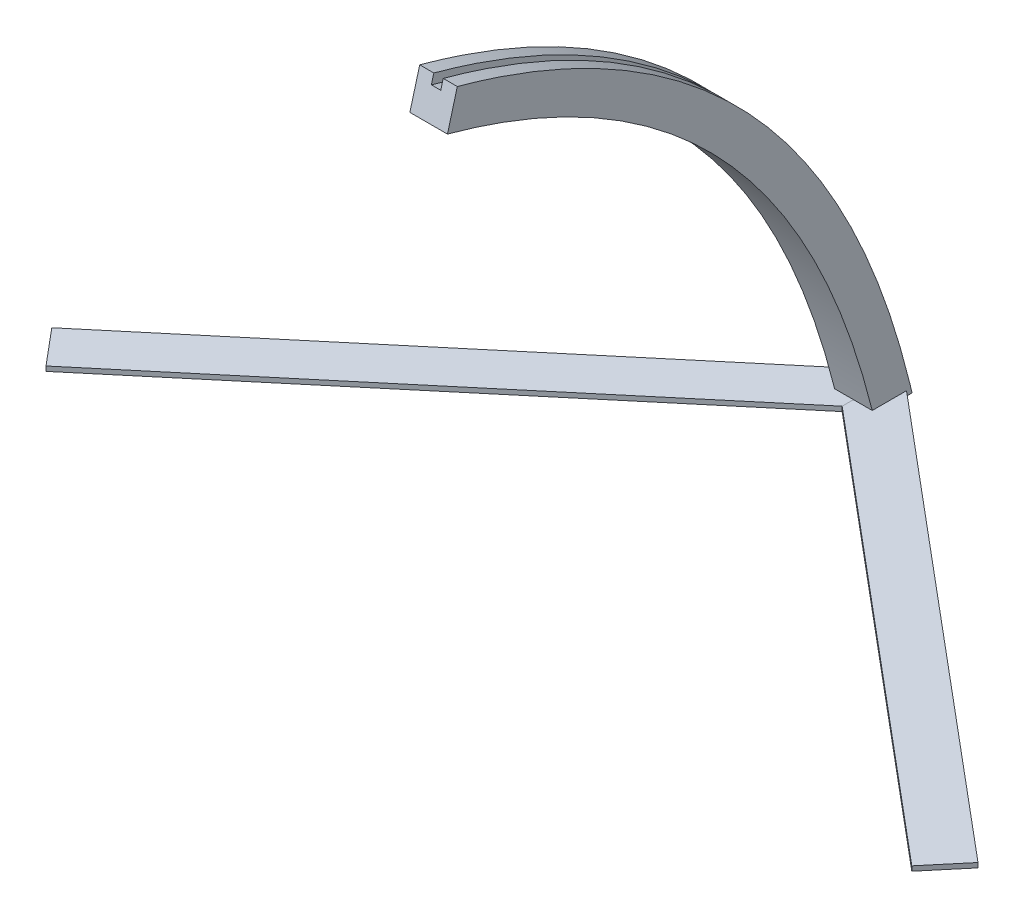
ISO-10303-21;
HEADER;
FILE_DESCRIPTION(('STEP AP214'),'2;1');
FILE_NAME('part.step','',(''),(''),'','','');
FILE_SCHEMA(('AUTOMOTIVE_DESIGN { 1 0 10303 214 1 1 1 1 }'));
ENDSEC;
DATA;
#1=APPLICATION_CONTEXT('core data for automotive mechanical design processes');
#2=APPLICATION_PROTOCOL_DEFINITION('international standard','automotive_design',2000,#1);
#3=PRODUCT_CONTEXT('',#1,'mechanical');
#4=PRODUCT('Part','Part','',(#3));
#5=PRODUCT_RELATED_PRODUCT_CATEGORY('part','',(#4));
#6=PRODUCT_DEFINITION_FORMATION('','',#4);
#7=PRODUCT_DEFINITION_CONTEXT('part definition',#1,'design');
#8=PRODUCT_DEFINITION('design','',#6,#7);
#9=PRODUCT_DEFINITION_SHAPE('','',#8);
#10=(LENGTH_UNIT() NAMED_UNIT(*) SI_UNIT(.MILLI.,.METRE.));
#11=(NAMED_UNIT(*) PLANE_ANGLE_UNIT() SI_UNIT($,.RADIAN.));
#12=(NAMED_UNIT(*) SI_UNIT($,.STERADIAN.) SOLID_ANGLE_UNIT());
#13=UNCERTAINTY_MEASURE_WITH_UNIT(LENGTH_MEASURE(1.E-05),#10,'distance_accuracy_value','');
#14=(GEOMETRIC_REPRESENTATION_CONTEXT(3) GLOBAL_UNCERTAINTY_ASSIGNED_CONTEXT((#13)) GLOBAL_UNIT_ASSIGNED_CONTEXT((#10,
#11,#12)) REPRESENTATION_CONTEXT('',''));
#15=CARTESIAN_POINT('',(0.,0.,0.));
#16=DIRECTION('',(0.,0.,1.));
#17=DIRECTION('',(1.,0.,0.));
#18=AXIS2_PLACEMENT_3D('',#15,#16,#17);
#19=CARTESIAN_POINT('',(-5.08,2.48064780974044,-4.93363272657894));
#20=DIRECTION('',(-1.,0.,0.));
#21=DIRECTION('',(0.,0.,1.));
#22=AXIS2_PLACEMENT_3D('',#19,#20,#21);
#23=PLANE('',#22);
#24=DIRECTION('',(0.,0.97118754460215,0.238316497980409));
#25=VECTOR('',#24,1.);
#26=CARTESIAN_POINT('',(-5.08,-2.69966655316738,-6.20481292680644));
#27=LINE('',#26,#25);
#28=CARTESIAN_POINT('',(-5.08,0.,-5.54235068432653));
#29=VERTEX_POINT('',#28);
#30=CARTESIAN_POINT('',(-5.08,2.48064780974044,-4.93363272657894));
#31=VERTEX_POINT('',#30);
#32=EDGE_CURVE('E43',#29,#31,#27,.T.);
#33=ORIENTED_EDGE('',*,*,#32,.F.);
#34=DIRECTION('',(0.,0.,1.));
#35=VECTOR('',#34,1.);
#36=CARTESIAN_POINT('',(-5.08,0.,-4.93363272657894));
#37=LINE('',#36,#35);
#38=CARTESIAN_POINT('',(-5.08,0.,-4.02671016087938));
#39=VERTEX_POINT('',#38);
#40=EDGE_CURVE('E367',#29,#39,#37,.T.);
#41=ORIENTED_EDGE('',*,*,#40,.T.);
#42=DIRECTION('',(0.,-1.,0.));
#43=VECTOR('',#42,1.);
#44=CARTESIAN_POINT('',(-5.08,1.26999999999999,-4.02671016087938));
#45=LINE('',#44,#43);
#46=CARTESIAN_POINT('',(-5.08,1.27,-4.02671016087938));
#47=VERTEX_POINT('',#46);
#48=EDGE_CURVE('E267',#47,#39,#45,.T.);
#49=ORIENTED_EDGE('',*,*,#48,.F.);
#50=DIRECTION('',(0.,0.,1.));
#51=VECTOR('',#50,1.);
#52=CARTESIAN_POINT('',(-5.08,1.26999999999999,106.464382213805));
#53=LINE('',#52,#51);
#54=CARTESIAN_POINT('',(-5.08,1.27,5.2338859838432));
#55=VERTEX_POINT('',#54);
#56=EDGE_CURVE('E50',#47,#55,#53,.T.);
#57=ORIENTED_EDGE('',*,*,#56,.T.);
#58=CARTESIAN_POINT('',(-5.08,0.0593521902594873,4.9336327265789));
#59=CARTESIAN_POINT('',(-5.08,33.2508610878055,13.0783872666519));
#60=CARTESIAN_POINT('',(-5.08,59.8755567879164,26.7405853876721));
#61=CARTESIAN_POINT('',(-5.08,90.5340659689814,55.3980025006643));
#62=CARTESIAN_POINT('',(-5.08,99.2141525950362,66.3212104822444));
#63=CARTESIAN_POINT('',(-5.08,113.560991349138,91.0169754989488));
#64=CARTESIAN_POINT('',(-5.08,119.2261047089,104.792235016412));
#65=CARTESIAN_POINT('',(-5.08,123.367568463531,120.042040830703));
#66=B_SPLINE_CURVE_WITH_KNOTS('',3,(#58,#59,#60,#61,#62,#63,#64,#65),.UNSPECIFIED.,.F.,.F.,(4,2,
2,4),(0.,0.5,0.75,1.),.UNSPECIFIED.);
#67=CARTESIAN_POINT('',(-5.08,123.367568463531,120.042040830703));
#68=VERTEX_POINT('',#67);
#69=EDGE_CURVE('E402',#55,#68,#66,.T.);
#70=ORIENTED_EDGE('',*,*,#69,.T.);
#71=DIRECTION('',(0.,-0.965045578045034,0.262082109835309));
#72=VECTOR('',#71,1.);
#73=CARTESIAN_POINT('',(-5.08,133.172431536469,117.379286594777));
#74=LINE('',#73,#72);
#75=CARTESIAN_POINT('',(-5.08,133.172431536469,117.379286594777));
#76=VERTEX_POINT('',#75);
#77=EDGE_CURVE('E420',#76,#68,#74,.T.);
#78=ORIENTED_EDGE('',*,*,#77,.F.);
#79=CARTESIAN_POINT('',(-5.08,2.48064780974044,-4.93363272657894));
#80=CARTESIAN_POINT('',(-5.08,36.9738163687706,3.53053177074244));
#81=CARTESIAN_POINT('',(-5.08,65.3581260630799,17.9579037867018));
#82=CARTESIAN_POINT('',(-5.08,98.199616882343,48.6558185306366));
#83=CARTESIAN_POINT('',(-5.08,107.517278907934,60.3878839424756));
#84=CARTESIAN_POINT('',(-5.08,122.828101424715,86.742991263929));
#85=CARTESIAN_POINT('',(-5.08,128.82290068473,101.363330690402));
#86=CARTESIAN_POINT('',(-5.08,133.172431536469,117.379286594777));
#87=B_SPLINE_CURVE_WITH_KNOTS('',3,(#79,#80,#81,#82,#83,#84,#85,#86),.UNSPECIFIED.,.F.,.F.,(4,2,
2,4),(0.,0.5,0.75,1.),.UNSPECIFIED.);
#88=EDGE_CURVE('E437',#31,#76,#87,.T.);
#89=ORIENTED_EDGE('',*,*,#88,.F.);
#90=EDGE_LOOP('',(#33,#41,#49,#57,#70,#78,#89));
#91=FACE_BOUND('',#90,.T.);
#92=ADVANCED_FACE('F39',(#91),#23,.T.);
#93=CARTESIAN_POINT('',(5.08,2.48064780974044,-4.93363272657894));
#94=DIRECTION('',(-1.,0.,0.));
#95=DIRECTION('',(0.,0.,1.));
#96=AXIS2_PLACEMENT_3D('',#93,#94,#95);
#97=PLANE('',#96);
#98=DIRECTION('',(0.,1.,0.));
#99=VECTOR('',#98,1.);
#100=CARTESIAN_POINT('',(5.08,1.27,-4.0267101608794));
#101=LINE('',#100,#99);
#102=CARTESIAN_POINT('',(5.08,0.,-4.0267101608794));
#103=VERTEX_POINT('',#102);
#104=CARTESIAN_POINT('',(5.08,1.27,-4.0267101608794));
#105=VERTEX_POINT('',#104);
#106=EDGE_CURVE('E284',#103,#105,#101,.T.);
#107=ORIENTED_EDGE('',*,*,#106,.F.);
#108=DIRECTION('',(0.,0.,1.));
#109=VECTOR('',#108,1.);
#110=CARTESIAN_POINT('',(5.08,0.,-4.93363272657894));
#111=LINE('',#110,#109);
#112=CARTESIAN_POINT('',(5.08,0.,-5.54235068432653));
#113=VERTEX_POINT('',#112);
#114=EDGE_CURVE('E204',#103,#113,#111,.F.);
#115=ORIENTED_EDGE('',*,*,#114,.T.);
#116=DIRECTION('',(0.,0.97118754460215,0.238316497980409));
#117=VECTOR('',#116,1.);
#118=CARTESIAN_POINT('',(5.08,-2.69966655316738,-6.20481292680644));
#119=LINE('',#118,#117);
#120=CARTESIAN_POINT('',(5.08,2.48064780974048,-4.93363272657893));
#121=VERTEX_POINT('',#120);
#122=EDGE_CURVE('E199',#113,#121,#119,.T.);
#123=ORIENTED_EDGE('',*,*,#122,.T.);
#124=CARTESIAN_POINT('',(5.08,2.48064780974044,-4.93363272657894));
#125=CARTESIAN_POINT('',(5.08,36.9738163687706,3.53053177074244));
#126=CARTESIAN_POINT('',(5.08,65.3581260630799,17.9579037867018));
#127=CARTESIAN_POINT('',(5.08,98.199616882343,48.6558185306366));
#128=CARTESIAN_POINT('',(5.08,107.517278907934,60.3878839424756));
#129=CARTESIAN_POINT('',(5.08,122.828101424715,86.742991263929));
#130=CARTESIAN_POINT('',(5.08,128.82290068473,101.363330690402));
#131=CARTESIAN_POINT('',(5.08,133.172431536469,117.379286594777));
#132=B_SPLINE_CURVE_WITH_KNOTS('',3,(#124,#125,#126,#127,#128,#129,#130,#131),.UNSPECIFIED.,.F.,
.F.,(4,2,2,4),(0.,0.5,0.75,1.),.UNSPECIFIED.);
#133=CARTESIAN_POINT('',(5.08,133.172431536469,117.379286594777));
#134=VERTEX_POINT('',#133);
#135=EDGE_CURVE('E384',#121,#134,#132,.T.);
#136=ORIENTED_EDGE('',*,*,#135,.T.);
#137=DIRECTION('',(0.,0.965045578045034,-0.262082109835309));
#138=VECTOR('',#137,1.);
#139=CARTESIAN_POINT('',(5.08,133.172431536469,117.379286594777));
#140=LINE('',#139,#138);
#141=CARTESIAN_POINT('',(5.08,123.367568463531,120.042040830703));
#142=VERTEX_POINT('',#141);
#143=EDGE_CURVE('E419',#142,#134,#140,.T.);
#144=ORIENTED_EDGE('',*,*,#143,.F.);
#145=CARTESIAN_POINT('',(5.08,0.0593521902594873,4.9336327265789));
#146=CARTESIAN_POINT('',(5.08,33.2508610878055,13.0783872666519));
#147=CARTESIAN_POINT('',(5.08,59.8755567879164,26.7405853876721));
#148=CARTESIAN_POINT('',(5.08,90.5340659689814,55.3980025006643));
#149=CARTESIAN_POINT('',(5.08,99.2141525950362,66.3212104822444));
#150=CARTESIAN_POINT('',(5.08,113.560991349138,91.0169754989488));
#151=CARTESIAN_POINT('',(5.08,119.2261047089,104.792235016412));
#152=CARTESIAN_POINT('',(5.08,123.367568463531,120.042040830703));
#153=B_SPLINE_CURVE_WITH_KNOTS('',3,(#145,#146,#147,#148,#149,#150,#151,#152),.UNSPECIFIED.,.F.,
.F.,(4,2,2,4),(0.,0.5,0.75,1.),.UNSPECIFIED.);
#154=CARTESIAN_POINT('',(5.08,1.27,5.23388598388158));
#155=VERTEX_POINT('',#154);
#156=EDGE_CURVE('E397',#155,#142,#153,.T.);
#157=ORIENTED_EDGE('',*,*,#156,.F.);
#158=DIRECTION('',(0.,0.,1.));
#159=VECTOR('',#158,1.);
#160=CARTESIAN_POINT('',(5.08,1.27,1.03265397203695));
#161=LINE('',#160,#159);
#162=EDGE_CURVE('E11',#155,#105,#161,.F.);
#163=ORIENTED_EDGE('',*,*,#162,.T.);
#164=EDGE_LOOP('',(#107,#115,#123,#136,#144,#157,#163));
#165=FACE_BOUND('',#164,.T.);
#166=ADVANCED_FACE('F381',(#165),#97,.F.);
#167=CARTESIAN_POINT('',(-5.08,-2.69966655316738,-6.20481292680644));
#168=DIRECTION('',(0.,-0.238316497980409,0.97118754460215));
#169=DIRECTION('',(0.,-0.97118754460215,-0.238316497980409));
#170=AXIS2_PLACEMENT_3D('',#167,#168,#169);
#171=PLANE('',#170);
#172=DIRECTION('',(1.,0.,0.));
#173=VECTOR('',#172,1.);
#174=CARTESIAN_POINT('',(-5.08,0.,-5.54235068432653));
#175=LINE('',#174,#173);
#176=CARTESIAN_POINT('',(-3.27372996110044,0.,-5.54235068432657));
#177=VERTEX_POINT('',#176);
#178=EDGE_CURVE('E371',#29,#177,#175,.T.);
#179=ORIENTED_EDGE('',*,*,#178,.F.);
#180=ORIENTED_EDGE('',*,*,#32,.T.);
#181=DIRECTION('',(-1.,0.,0.));
#182=VECTOR('',#181,1.);
#183=CARTESIAN_POINT('',(-5.08,2.48064780974044,-4.93363272657894));
#184=LINE('',#183,#182);
#185=CARTESIAN_POINT('',(-1.27,2.48064780974048,-4.93363272657893));
#186=VERTEX_POINT('',#185);
#187=EDGE_CURVE('E451',#186,#31,#184,.T.);
#188=ORIENTED_EDGE('',*,*,#187,.F.);
#189=DIRECTION('',(0.,0.97118754460215,0.238316497980409));
#190=VECTOR('',#189,1.);
#191=CARTESIAN_POINT('',(-1.27,-2.69966655316738,-6.20481292680644));
#192=LINE('',#191,#190);
#193=CARTESIAN_POINT('',(-1.27,1.27,-5.2307095866649));
#194=VERTEX_POINT('',#193);
#195=EDGE_CURVE('E244',#194,#186,#192,.T.);
#196=ORIENTED_EDGE('',*,*,#195,.F.);
#197=DIRECTION('',(1.,0.,0.));
#198=VECTOR('',#197,1.);
#199=CARTESIAN_POINT('',(-117.000463686063,1.27000000000001,-5.2307095866649));
#200=LINE('',#199,#198);
#201=CARTESIAN_POINT('',(-3.6451293588387,1.27,-5.23070958666492));
#202=VERTEX_POINT('',#201);
#203=EDGE_CURVE('E263',#202,#194,#200,.T.);
#204=ORIENTED_EDGE('',*,*,#203,.F.);
#205=DIRECTION('',(-0.273209114549436,0.934238390236474,0.229249667252702));
#206=VECTOR('',#205,1.);
#207=CARTESIAN_POINT('',(-19.1021462461038,54.125259234053,7.73926758254014));
#208=LINE('',#207,#206);
#209=EDGE_CURVE('E259',#177,#202,#208,.T.);
#210=ORIENTED_EDGE('',*,*,#209,.F.);
#211=EDGE_LOOP('',(#179,#180,#188,#196,#204,#210));
#212=FACE_BOUND('',#211,.T.);
#213=ADVANCED_FACE('F627',(#212),#171,.F.);
#214=CARTESIAN_POINT('',(1.27,-2.69966655316738,-6.20481292680644));
#215=DIRECTION('',(0.,-0.238316497980409,0.97118754460215));
#216=DIRECTION('',(0.,-0.97118754460215,-0.238316497980409));
#217=AXIS2_PLACEMENT_3D('',#214,#215,#216);
#218=PLANE('',#217);
#219=DIRECTION('',(1.,0.,0.));
#220=VECTOR('',#219,1.);
#221=CARTESIAN_POINT('',(1.27,0.,-5.54235068432653));
#222=LINE('',#221,#220);
#223=CARTESIAN_POINT('',(3.27372996110051,0.,-5.54235068432653));
#224=VERTEX_POINT('',#223);
#225=EDGE_CURVE('E193',#224,#113,#222,.T.);
#226=ORIENTED_EDGE('',*,*,#225,.F.);
#227=DIRECTION('',(-0.273209114549436,-0.934238390236474,-0.229249667252702));
#228=VECTOR('',#227,1.);
#229=CARTESIAN_POINT('',(3.11981123537628,-0.526324982916478,-5.67150383031301));
#230=LINE('',#229,#228);
#231=CARTESIAN_POINT('',(3.64512935883877,1.27,-5.2307095866649));
#232=VERTEX_POINT('',#231);
#233=EDGE_CURVE('E196',#232,#224,#230,.T.);
#234=ORIENTED_EDGE('',*,*,#233,.F.);
#235=DIRECTION('',(1.,0.,0.));
#236=VECTOR('',#235,1.);
#237=CARTESIAN_POINT('',(-8.6481772194819,1.27,-5.2307095866649));
#238=LINE('',#237,#236);
#239=CARTESIAN_POINT('',(1.27,1.27,-5.2307095866649));
#240=VERTEX_POINT('',#239);
#241=EDGE_CURVE('E216',#240,#232,#238,.T.);
#242=ORIENTED_EDGE('',*,*,#241,.F.);
#243=DIRECTION('',(0.,0.97118754460215,0.238316497980409));
#244=VECTOR('',#243,1.);
#245=CARTESIAN_POINT('',(1.27,-2.69966655316738,-6.20481292680644));
#246=LINE('',#245,#244);
#247=CARTESIAN_POINT('',(1.27,2.48064780974048,-4.93363272657893));
#248=VERTEX_POINT('',#247);
#249=EDGE_CURVE('E360',#240,#248,#246,.T.);
#250=ORIENTED_EDGE('',*,*,#249,.T.);
#251=DIRECTION('',(-1.,0.,0.));
#252=VECTOR('',#251,1.);
#253=CARTESIAN_POINT('',(1.27,2.48064780974044,-4.93363272657894));
#254=LINE('',#253,#252);
#255=EDGE_CURVE('E288',#121,#248,#254,.T.);
#256=ORIENTED_EDGE('',*,*,#255,.F.);
#257=ORIENTED_EDGE('',*,*,#122,.F.);
#258=EDGE_LOOP('',(#226,#234,#242,#250,#256,#257));
#259=FACE_BOUND('',#258,.T.);
#260=ADVANCED_FACE('F195',(#259),#218,.F.);
#261=CARTESIAN_POINT('',(-8.6481772194819,1.27,1.03265397203695));
#262=DIRECTION('',(0.,1.,0.));
#263=DIRECTION('',(0.,0.,1.));
#264=AXIS2_PLACEMENT_3D('',#261,#262,#263);
#265=PLANE('',#264);
#266=DIRECTION('',(0.766044443118979,0.,0.642787609686538));
#267=VECTOR('',#266,1.);
#268=CARTESIAN_POINT('',(-0.484774576462871,1.27,-8.69611045557409));
#269=LINE('',#268,#267);
#270=CARTESIAN_POINT('',(125.163866329082,1.27,96.7356177861945));
#271=VERTEX_POINT('',#270);
#272=EDGE_CURVE('E535',#105,#271,#269,.T.);
#273=ORIENTED_EDGE('',*,*,#272,.F.);
#274=ORIENTED_EDGE('',*,*,#162,.F.);
#275=DIRECTION('',(1.,0.,0.));
#276=VECTOR('',#275,1.);
#277=CARTESIAN_POINT('',(0.,1.27,5.2338859838432));
#278=LINE('',#277,#276);
#279=CARTESIAN_POINT('',(0.,1.27,5.2338859838432));
#280=VERTEX_POINT('',#279);
#281=EDGE_CURVE('E438',#280,#155,#278,.T.);
#282=ORIENTED_EDGE('',*,*,#281,.F.);
#283=DIRECTION('',(0.,0.,-1.));
#284=VECTOR('',#283,1.);
#285=CARTESIAN_POINT('',(0.,1.26999999999999,106.464382213805));
#286=LINE('',#285,#284);
#287=CARTESIAN_POINT('',(0.,1.27,8.28933628725995));
#288=VERTEX_POINT('',#287);
#289=EDGE_CURVE('E545',#288,#280,#286,.T.);
#290=ORIENTED_EDGE('',*,*,#289,.F.);
#291=DIRECTION('',(0.766044443118979,0.,0.642787609686538));
#292=VECTOR('',#291,1.);
#293=CARTESIAN_POINT('',(-8.6481772194819,1.27,1.03265397203695));
#294=LINE('',#293,#292);
#295=CARTESIAN_POINT('',(117.000463686063,1.27,106.464382213805));
#296=VERTEX_POINT('',#295);
#297=EDGE_CURVE('E230',#288,#296,#294,.T.);
#298=ORIENTED_EDGE('',*,*,#297,.T.);
#299=DIRECTION('',(-0.642787609686538,0.,0.766044443118979));
#300=VECTOR('',#299,1.);
#301=CARTESIAN_POINT('',(117.000463686063,1.27,106.464382213805));
#302=LINE('',#301,#300);
#303=EDGE_CURVE('E516',#271,#296,#302,.T.);
#304=ORIENTED_EDGE('',*,*,#303,.F.);
#305=EDGE_LOOP('',(#273,#274,#282,#290,#298,#304));
#306=FACE_BOUND('',#305,.T.);
#307=ADVANCED_FACE('F543',(#306),#265,.T.);
#308=CARTESIAN_POINT('',(-117.000463686063,1.27,106.464382213805));
#309=DIRECTION('',(0.,1.,0.));
#310=DIRECTION('',(0.,0.,1.));
#311=AXIS2_PLACEMENT_3D('',#308,#309,#310);
#312=PLANE('',#311);
#313=ORIENTED_EDGE('',*,*,#56,.F.);
#314=DIRECTION('',(0.766044443118979,0.,-0.642787609686538));
#315=VECTOR('',#314,1.);
#316=CARTESIAN_POINT('',(-125.163866329082,1.27,96.7356177861945));
#317=LINE('',#316,#315);
#318=CARTESIAN_POINT('',(-125.163866329082,1.27,96.7356177861945));
#319=VERTEX_POINT('',#318);
#320=EDGE_CURVE('E560',#319,#47,#317,.T.);
#321=ORIENTED_EDGE('',*,*,#320,.F.);
#322=DIRECTION('',(0.642787609686538,0.,0.766044443118979));
#323=VECTOR('',#322,1.);
#324=CARTESIAN_POINT('',(-117.000463686063,1.27,106.464382213805));
#325=LINE('',#324,#323);
#326=CARTESIAN_POINT('',(-117.000463686063,1.27,106.464382213805));
#327=VERTEX_POINT('',#326);
#328=EDGE_CURVE('E564',#319,#327,#325,.T.);
#329=ORIENTED_EDGE('',*,*,#328,.T.);
#330=DIRECTION('',(0.766044443118979,0.,-0.642787609686538));
#331=VECTOR('',#330,1.);
#332=CARTESIAN_POINT('',(-117.000463686063,1.27,106.464382213805));
#333=LINE('',#332,#331);
#334=EDGE_CURVE('E555',#327,#288,#333,.T.);
#335=ORIENTED_EDGE('',*,*,#334,.T.);
#336=ORIENTED_EDGE('',*,*,#289,.T.);
#337=DIRECTION('',(1.,0.,0.));
#338=VECTOR('',#337,1.);
#339=CARTESIAN_POINT('',(0.,1.27,5.2338859838432));
#340=LINE('',#339,#338);
#341=EDGE_CURVE('E64',#55,#280,#340,.T.);
#342=ORIENTED_EDGE('',*,*,#341,.F.);
#343=EDGE_LOOP('',(#313,#321,#329,#335,#336,#342));
#344=FACE_BOUND('',#343,.T.);
#345=ADVANCED_FACE('F562',(#344),#312,.T.);
#346=CARTESIAN_POINT('',(-0.484774576462871,1.27,-8.69611045557409));
#347=DIRECTION('',(0.642787609686538,0.,-0.766044443118979));
#348=DIRECTION('',(-0.766044443118979,0.,-0.642787609686538));
#349=AXIS2_PLACEMENT_3D('',#346,#347,#348);
#350=PLANE('',#349);
#351=DIRECTION('',(0.766044443118979,0.,0.642787609686538));
#352=VECTOR('',#351,1.);
#353=CARTESIAN_POINT('',(-0.484774576462871,0.,-8.69611045557409));
#354=LINE('',#353,#352);
#355=CARTESIAN_POINT('',(125.163866329082,0.,96.7356177861945));
#356=VERTEX_POINT('',#355);
#357=EDGE_CURVE('E225',#103,#356,#354,.T.);
#358=ORIENTED_EDGE('',*,*,#357,.F.);
#359=ORIENTED_EDGE('',*,*,#106,.T.);
#360=ORIENTED_EDGE('',*,*,#272,.T.);
#361=DIRECTION('',(0.,1.,0.));
#362=VECTOR('',#361,1.);
#363=CARTESIAN_POINT('',(125.163866329082,1.27,96.7356177861945));
#364=LINE('',#363,#362);
#365=EDGE_CURVE('E518',#356,#271,#364,.T.);
#366=ORIENTED_EDGE('',*,*,#365,.F.);
#367=EDGE_LOOP('',(#358,#359,#360,#366));
#368=FACE_BOUND('',#367,.T.);
#369=ADVANCED_FACE('F542',(#368),#350,.T.);
#370=CARTESIAN_POINT('',(-125.163866329082,1.27,96.7356177861945));
#371=DIRECTION('',(-0.642787609686538,0.,-0.766044443118979));
#372=DIRECTION('',(-0.766044443118979,0.,0.642787609686538));
#373=AXIS2_PLACEMENT_3D('',#370,#371,#372);
#374=PLANE('',#373);
#375=ORIENTED_EDGE('',*,*,#320,.T.);
#376=ORIENTED_EDGE('',*,*,#48,.T.);
#377=DIRECTION('',(0.766044443118979,0.,-0.642787609686538));
#378=VECTOR('',#377,1.);
#379=CARTESIAN_POINT('',(-125.163866329082,0.,96.7356177861945));
#380=LINE('',#379,#378);
#381=CARTESIAN_POINT('',(-125.163866329082,0.,96.7356177861945));
#382=VERTEX_POINT('',#381);
#383=EDGE_CURVE('E578',#382,#39,#380,.T.);
#384=ORIENTED_EDGE('',*,*,#383,.F.);
#385=DIRECTION('',(0.,1.,0.));
#386=VECTOR('',#385,1.);
#387=CARTESIAN_POINT('',(-125.163866329082,1.27,96.7356177861945));
#388=LINE('',#387,#386);
#389=EDGE_CURVE('E571',#382,#319,#388,.T.);
#390=ORIENTED_EDGE('',*,*,#389,.T.);
#391=EDGE_LOOP('',(#375,#376,#384,#390));
#392=FACE_BOUND('',#391,.T.);
#393=ADVANCED_FACE('F645',(#392),#374,.T.);
#394=CARTESIAN_POINT('',(-117.000463686063,0.,106.464382213805));
#395=DIRECTION('',(0.,-1.,0.));
#396=DIRECTION('',(0.,0.,-1.));
#397=AXIS2_PLACEMENT_3D('',#394,#395,#396);
#398=PLANE('',#397);
#399=CARTESIAN_POINT('',(0.,0.,-8.28933628725997));
#400=VERTEX_POINT('',#399);
#401=EDGE_CURVE('E211',#400,#224,#354,.T.);
#402=ORIENTED_EDGE('',*,*,#401,.T.);
#403=ORIENTED_EDGE('',*,*,#225,.T.);
#404=ORIENTED_EDGE('',*,*,#114,.F.);
#405=ORIENTED_EDGE('',*,*,#357,.T.);
#406=DIRECTION('',(0.642787609686538,0.,-0.766044443118979));
#407=VECTOR('',#406,1.);
#408=CARTESIAN_POINT('',(117.000463686063,0.,106.464382213805));
#409=LINE('',#408,#407);
#410=CARTESIAN_POINT('',(117.000463686063,0.,106.464382213805));
#411=VERTEX_POINT('',#410);
#412=EDGE_CURVE('E525',#411,#356,#409,.T.);
#413=ORIENTED_EDGE('',*,*,#412,.F.);
#414=DIRECTION('',(0.766044443118979,0.,0.642787609686538));
#415=VECTOR('',#414,1.);
#416=CARTESIAN_POINT('',(-8.6481772194819,0.,1.03265397203695));
#417=LINE('',#416,#415);
#418=CARTESIAN_POINT('',(0.,0.,8.28933628725995));
#419=VERTEX_POINT('',#418);
#420=EDGE_CURVE('E224',#419,#411,#417,.T.);
#421=ORIENTED_EDGE('',*,*,#420,.F.);
#422=DIRECTION('',(0.766044443118979,0.,-0.642787609686538));
#423=VECTOR('',#422,1.);
#424=CARTESIAN_POINT('',(-117.000463686063,0.,106.464382213805));
#425=LINE('',#424,#423);
#426=CARTESIAN_POINT('',(-117.000463686063,0.,106.464382213805));
#427=VERTEX_POINT('',#426);
#428=EDGE_CURVE('E557',#427,#419,#425,.T.);
#429=ORIENTED_EDGE('',*,*,#428,.F.);
#430=DIRECTION('',(-0.642787609686538,0.,-0.766044443118979));
#431=VECTOR('',#430,1.);
#432=CARTESIAN_POINT('',(-117.000463686063,0.,106.464382213805));
#433=LINE('',#432,#431);
#434=EDGE_CURVE('E574',#427,#382,#433,.T.);
#435=ORIENTED_EDGE('',*,*,#434,.T.);
#436=ORIENTED_EDGE('',*,*,#383,.T.);
#437=ORIENTED_EDGE('',*,*,#40,.F.);
#438=ORIENTED_EDGE('',*,*,#178,.T.);
#439=EDGE_CURVE('E569',#177,#400,#380,.T.);
#440=ORIENTED_EDGE('',*,*,#439,.T.);
#441=EDGE_LOOP('',(#402,#403,#404,#405,#413,#421,#429,#435,#436,#437,#438,#440));
#442=FACE_BOUND('',#441,.T.);
#443=ADVANCED_FACE('F221',(#442),#398,.T.);
#444=CARTESIAN_POINT('',(121.082165007572,0.,101.6));
#445=DIRECTION('',(0.766044443118979,0.,0.642787609686538));
#446=DIRECTION('',(0.642787609686538,0.,-0.766044443118979));
#447=AXIS2_PLACEMENT_3D('',#444,#445,#446);
#448=PLANE('',#447);
#449=DIRECTION('',(0.,-1.,0.));
#450=VECTOR('',#449,1.);
#451=CARTESIAN_POINT('',(117.000463686063,1.27,106.464382213805));
#452=LINE('',#451,#450);
#453=EDGE_CURVE('E533',#296,#411,#452,.T.);
#454=ORIENTED_EDGE('',*,*,#453,.T.);
#455=ORIENTED_EDGE('',*,*,#412,.T.);
#456=ORIENTED_EDGE('',*,*,#365,.T.);
#457=ORIENTED_EDGE('',*,*,#303,.T.);
#458=EDGE_LOOP('',(#454,#455,#456,#457));
#459=FACE_BOUND('',#458,.T.);
#460=ADVANCED_FACE('F41',(#459),#448,.T.);
#461=CARTESIAN_POINT('',(-121.082165007572,0.,101.6));
#462=DIRECTION('',(0.766044443118979,0.,-0.642787609686538));
#463=DIRECTION('',(-0.642787609686538,0.,-0.766044443118979));
#464=AXIS2_PLACEMENT_3D('',#461,#462,#463);
#465=PLANE('',#464);
#466=DIRECTION('',(0.,-1.,0.));
#467=VECTOR('',#466,1.);
#468=CARTESIAN_POINT('',(-117.000463686063,1.27,106.464382213805));
#469=LINE('',#468,#467);
#470=EDGE_CURVE('E238',#327,#427,#469,.T.);
#471=ORIENTED_EDGE('',*,*,#470,.F.);
#472=ORIENTED_EDGE('',*,*,#328,.F.);
#473=ORIENTED_EDGE('',*,*,#389,.F.);
#474=ORIENTED_EDGE('',*,*,#434,.F.);
#475=EDGE_LOOP('',(#471,#472,#473,#474));
#476=FACE_BOUND('',#475,.T.);
#477=ADVANCED_FACE('F647',(#476),#465,.F.);
#478=CARTESIAN_POINT('',(-8.6481772194819,1.27,1.03265397203695));
#479=DIRECTION('',(-0.642787609686538,0.,0.766044443118979));
#480=DIRECTION('',(0.766044443118979,0.,0.642787609686538));
#481=AXIS2_PLACEMENT_3D('',#478,#479,#480);
#482=PLANE('',#481);
#483=DIRECTION('',(0.,1.,0.));
#484=VECTOR('',#483,1.);
#485=CARTESIAN_POINT('',(0.,1.27,8.28933628725997));
#486=LINE('',#485,#484);
#487=EDGE_CURVE('E528',#419,#288,#486,.T.);
#488=ORIENTED_EDGE('',*,*,#487,.F.);
#489=ORIENTED_EDGE('',*,*,#420,.T.);
#490=ORIENTED_EDGE('',*,*,#453,.F.);
#491=ORIENTED_EDGE('',*,*,#297,.F.);
#492=EDGE_LOOP('',(#488,#489,#490,#491));
#493=FACE_BOUND('',#492,.T.);
#494=ADVANCED_FACE('F548',(#493),#482,.T.);
#495=CARTESIAN_POINT('',(-117.000463686063,1.27,106.464382213805));
#496=DIRECTION('',(0.642787609686538,0.,0.766044443118979));
#497=DIRECTION('',(0.766044443118979,0.,-0.642787609686538));
#498=AXIS2_PLACEMENT_3D('',#495,#496,#497);
#499=PLANE('',#498);
#500=ORIENTED_EDGE('',*,*,#428,.T.);
#501=ORIENTED_EDGE('',*,*,#487,.T.);
#502=ORIENTED_EDGE('',*,*,#334,.F.);
#503=ORIENTED_EDGE('',*,*,#470,.T.);
#504=EDGE_LOOP('',(#500,#501,#502,#503));
#505=FACE_BOUND('',#504,.T.);
#506=ADVANCED_FACE('F553',(#505),#499,.T.);
#507=CARTESIAN_POINT('',(0.,38.8349269176126,142.998980430578));
#508=DIRECTION('',(0.,0.262082109835309,0.965045578045034));
#509=DIRECTION('',(0.,-0.965045578045034,0.262082109835309));
#510=AXIS2_PLACEMENT_3D('',#507,#508,#509);
#511=PLANE('',#510);
#512=ORIENTED_EDGE('',*,*,#77,.T.);
#513=DIRECTION('',(1.,0.,0.));
#514=VECTOR('',#513,1.);
#515=CARTESIAN_POINT('',(-5.08,123.367568463531,120.042040830703));
#516=LINE('',#515,#514);
#517=EDGE_CURVE('E412',#68,#142,#516,.T.);
#518=ORIENTED_EDGE('',*,*,#517,.T.);
#519=ORIENTED_EDGE('',*,*,#143,.T.);
#520=DIRECTION('',(-1.,0.,0.));
#521=VECTOR('',#520,1.);
#522=CARTESIAN_POINT('',(1.27,133.172431536469,117.379286594777));
#523=LINE('',#522,#521);
#524=CARTESIAN_POINT('',(1.27,133.172431536469,117.379286594777));
#525=VERTEX_POINT('',#524);
#526=EDGE_CURVE('E395',#134,#525,#523,.T.);
#527=ORIENTED_EDGE('',*,*,#526,.T.);
#528=DIRECTION('',(0.,-0.965045578045033,0.262082109835313));
#529=VECTOR('',#528,1.);
#530=CARTESIAN_POINT('',(1.27,130.721215768234,118.044975153758));
#531=LINE('',#530,#529);
#532=CARTESIAN_POINT('',(1.27,130.721215768234,118.044975153758));
#533=VERTEX_POINT('',#532);
#534=EDGE_CURVE('E496',#525,#533,#531,.T.);
#535=ORIENTED_EDGE('',*,*,#534,.T.);
#536=DIRECTION('',(-1.,0.,0.));
#537=VECTOR('',#536,1.);
#538=CARTESIAN_POINT('',(-1.27,130.721215768234,118.044975153758));
#539=LINE('',#538,#537);
#540=CARTESIAN_POINT('',(-1.27,130.721215768234,118.044975153758));
#541=VERTEX_POINT('',#540);
#542=EDGE_CURVE('E605',#533,#541,#539,.T.);
#543=ORIENTED_EDGE('',*,*,#542,.T.);
#544=DIRECTION('',(0.,0.965045578045033,-0.262082109835313));
#545=VECTOR('',#544,1.);
#546=CARTESIAN_POINT('',(-1.27,133.172431536469,117.379286594777));
#547=LINE('',#546,#545);
#548=CARTESIAN_POINT('',(-1.27,133.172431536469,117.379286594777));
#549=VERTEX_POINT('',#548);
#550=EDGE_CURVE('E480',#541,#549,#547,.T.);
#551=ORIENTED_EDGE('',*,*,#550,.T.);
#552=DIRECTION('',(-1.,0.,0.));
#553=VECTOR('',#552,1.);
#554=CARTESIAN_POINT('',(-5.08,133.172431536469,117.379286594777));
#555=LINE('',#554,#553);
#556=EDGE_CURVE('E477',#549,#76,#555,.T.);
#557=ORIENTED_EDGE('',*,*,#556,.T.);
#558=EDGE_LOOP('',(#512,#518,#519,#527,#535,#543,#551,#557));
#559=FACE_BOUND('',#558,.T.);
#560=ADVANCED_FACE('F508',(#559),#511,.T.);
#561=CARTESIAN_POINT('',(-5.08,0.0593521902594873,4.9336327265789));
#562=CARTESIAN_POINT('',(-5.08,33.2508610878055,13.0783872666519));
#563=CARTESIAN_POINT('',(-5.08,59.8755567879164,26.7405853876721));
#564=CARTESIAN_POINT('',(-5.08,90.5340659689814,55.3980025006643));
#565=CARTESIAN_POINT('',(-5.08,99.2141525950362,66.3212104822444));
#566=CARTESIAN_POINT('',(-5.08,113.560991349138,91.0169754989488));
#567=CARTESIAN_POINT('',(-5.08,119.2261047089,104.792235016412));
#568=CARTESIAN_POINT('',(-5.08,123.367568463531,120.042040830703));
#569=CARTESIAN_POINT('',(5.08,0.0593521902594873,4.9336327265789));
#570=CARTESIAN_POINT('',(5.08,33.2508610878055,13.0783872666519));
#571=CARTESIAN_POINT('',(5.08,59.8755567879164,26.7405853876721));
#572=CARTESIAN_POINT('',(5.08,90.5340659689814,55.3980025006643));
#573=CARTESIAN_POINT('',(5.08,99.2141525950362,66.3212104822444));
#574=CARTESIAN_POINT('',(5.08,113.560991349138,91.0169754989488));
#575=CARTESIAN_POINT('',(5.08,119.2261047089,104.792235016412));
#576=CARTESIAN_POINT('',(5.08,123.367568463531,120.042040830703));
#577=B_SPLINE_SURFACE_WITH_KNOTS('',1,3,((#561,#562,#563,#564,#565,#566,#567,#568),(#569,#570,
#571,#572,#573,#574,#575,#576)),.UNSPECIFIED.,.F.,.F.,.F.,(2,2),(4,2,2,4),(0.,1.),(0.,0.5,0.75,
1.),.UNSPECIFIED.);
#578=ORIENTED_EDGE('',*,*,#341,.T.);
#579=ORIENTED_EDGE('',*,*,#281,.T.);
#580=ORIENTED_EDGE('',*,*,#156,.T.);
#581=ORIENTED_EDGE('',*,*,#517,.F.);
#582=ORIENTED_EDGE('',*,*,#69,.F.);
#583=EDGE_LOOP('',(#578,#579,#580,#581,#582));
#584=FACE_BOUND('',#583,.T.);
#585=ADVANCED_FACE('F513',(#584),#577,.T.);
#586=CARTESIAN_POINT('',(5.08,2.48064780974044,-4.93363272657894));
#587=CARTESIAN_POINT('',(5.08,36.9738163687706,3.53053177074244));
#588=CARTESIAN_POINT('',(5.08,65.3581260630799,17.9579037867018));
#589=CARTESIAN_POINT('',(5.08,98.199616882343,48.6558185306366));
#590=CARTESIAN_POINT('',(5.08,107.517278907934,60.3878839424756));
#591=CARTESIAN_POINT('',(5.08,122.828101424715,86.742991263929));
#592=CARTESIAN_POINT('',(5.08,128.82290068473,101.363330690402));
#593=CARTESIAN_POINT('',(5.08,133.172431536469,117.379286594777));
#594=CARTESIAN_POINT('',(1.27,2.48064780974044,-4.93363272657894));
#595=CARTESIAN_POINT('',(1.27,36.9738163687706,3.53053177074244));
#596=CARTESIAN_POINT('',(1.27,65.3581260630799,17.9579037867018));
#597=CARTESIAN_POINT('',(1.27,98.199616882343,48.6558185306366));
#598=CARTESIAN_POINT('',(1.27,107.517278907934,60.3878839424756));
#599=CARTESIAN_POINT('',(1.27,122.828101424715,86.742991263929));
#600=CARTESIAN_POINT('',(1.27,128.82290068473,101.363330690402));
#601=CARTESIAN_POINT('',(1.27,133.172431536469,117.379286594777));
#602=B_SPLINE_SURFACE_WITH_KNOTS('',1,3,((#586,#587,#588,#589,#590,#591,#592,#593),(#594,#595,
#596,#597,#598,#599,#600,#601)),.UNSPECIFIED.,.F.,.F.,.F.,(2,2),(4,2,2,4),(0.,1.),(0.,0.5,0.75,
1.),.UNSPECIFIED.);
#603=CARTESIAN_POINT('',(1.27,2.48064780974044,-4.93363272657894));
#604=CARTESIAN_POINT('',(1.27,36.9738163687706,3.53053177074244));
#605=CARTESIAN_POINT('',(1.27,65.3581260630799,17.9579037867018));
#606=CARTESIAN_POINT('',(1.27,98.199616882343,48.6558185306366));
#607=CARTESIAN_POINT('',(1.27,107.517278907934,60.3878839424756));
#608=CARTESIAN_POINT('',(1.27,122.828101424715,86.742991263929));
#609=CARTESIAN_POINT('',(1.27,128.82290068473,101.363330690402));
#610=CARTESIAN_POINT('',(1.27,133.172431536469,117.379286594777));
#611=B_SPLINE_CURVE_WITH_KNOTS('',3,(#603,#604,#605,#606,#607,#608,#609,#610),.UNSPECIFIED.,.F.,
.F.,(4,2,2,4),(0.,0.5,0.75,1.),.UNSPECIFIED.);
#612=EDGE_CURVE('E358',#248,#525,#611,.T.);
#613=ORIENTED_EDGE('',*,*,#612,.T.);
#614=ORIENTED_EDGE('',*,*,#526,.F.);
#615=ORIENTED_EDGE('',*,*,#135,.F.);
#616=ORIENTED_EDGE('',*,*,#255,.T.);
#617=EDGE_LOOP('',(#613,#614,#615,#616));
#618=FACE_BOUND('',#617,.T.);
#619=ADVANCED_FACE('F394',(#618),#602,.T.);
#620=CARTESIAN_POINT('',(1.27,1.87532390487022,-2.46681636328949));
#621=DIRECTION('',(-1.,0.,0.));
#622=DIRECTION('',(0.,0.,1.));
#623=AXIS2_PLACEMENT_3D('',#620,#621,#622);
#624=PLANE('',#623);
#625=CARTESIAN_POINT('',(1.27,1.87532390487022,-2.46681636328949));
#626=CARTESIAN_POINT('',(1.27,36.0430775482875,5.91749564505214));
#627=CARTESIAN_POINT('',(1.27,63.9874837444901,20.1535741869947));
#628=CARTESIAN_POINT('',(1.27,107.048477623706,60.4039613018263));
#629=CARTESIAN_POINT('',(1.27,122.12741240059,86.4006483353701));
#630=CARTESIAN_POINT('',(1.27,130.721215768234,118.044975153758));
#631=B_SPLINE_CURVE_WITH_KNOTS('',3,(#625,#626,#627,#628,#629,#630),.UNSPECIFIED.,.F.,.F.,(4,2,
4),(0.,0.5,1.),.UNSPECIFIED.);
#632=CARTESIAN_POINT('',(1.27,1.87532390487025,-2.46681636328948));
#633=VERTEX_POINT('',#632);
#634=EDGE_CURVE('E354',#633,#533,#631,.T.);
#635=ORIENTED_EDGE('',*,*,#634,.T.);
#636=ORIENTED_EDGE('',*,*,#534,.F.);
#637=ORIENTED_EDGE('',*,*,#612,.F.);
#638=ORIENTED_EDGE('',*,*,#249,.F.);
#639=DIRECTION('',(0.,0.,-1.));
#640=VECTOR('',#639,1.);
#641=CARTESIAN_POINT('',(1.27,1.27,1.03265397203694));
#642=LINE('',#641,#640);
#643=CARTESIAN_POINT('',(1.27,1.27,-2.61535479333247));
#644=VERTEX_POINT('',#643);
#645=EDGE_CURVE('E217',#644,#240,#642,.T.);
#646=ORIENTED_EDGE('',*,*,#645,.F.);
#647=DIRECTION('',(0.,0.97118754460215,0.238316497980409));
#648=VECTOR('',#647,1.);
#649=CARTESIAN_POINT('',(1.27,-3.30499045803762,-3.73799656351699));
#650=LINE('',#649,#648);
#651=EDGE_CURVE('E359',#644,#633,#650,.T.);
#652=ORIENTED_EDGE('',*,*,#651,.T.);
#653=EDGE_LOOP('',(#635,#636,#637,#638,#646,#652));
#654=FACE_BOUND('',#653,.T.);
#655=ADVANCED_FACE('F316',(#654),#624,.T.);
#656=CARTESIAN_POINT('',(1.27,1.87532390487022,-2.46681636328949));
#657=CARTESIAN_POINT('',(1.27,36.0430775482875,5.91749564505214));
#658=CARTESIAN_POINT('',(1.27,63.9874837444901,20.1535741869947));
#659=CARTESIAN_POINT('',(1.27,96.2832291539021,50.3413645231184));
#660=CARTESIAN_POINT('',(1.27,105.441497329658,61.8712155775203));
#661=CARTESIAN_POINT('',(1.27,120.511323905872,87.8114873225815));
#662=CARTESIAN_POINT('',(1.27,126.423701690579,102.220556772023));
#663=CARTESIAN_POINT('',(1.27,130.721215768234,118.044975153758));
#664=CARTESIAN_POINT('',(-1.27,1.87532390487022,-2.46681636328949));
#665=CARTESIAN_POINT('',(-1.27,36.0430775482875,5.91749564505214));
#666=CARTESIAN_POINT('',(-1.27,63.9874837444901,20.1535741869947));
#667=CARTESIAN_POINT('',(-1.27,96.2832291539021,50.3413645231184));
#668=CARTESIAN_POINT('',(-1.27,105.441497329658,61.8712155775203));
#669=CARTESIAN_POINT('',(-1.27,120.511323905872,87.8114873225815));
#670=CARTESIAN_POINT('',(-1.27,126.423701690579,102.220556772023));
#671=CARTESIAN_POINT('',(-1.27,130.721215768234,118.044975153758));
#672=B_SPLINE_SURFACE_WITH_KNOTS('',1,3,((#656,#657,#658,#659,#660,#661,#662,#663),(#664,#665,
#666,#667,#668,#669,#670,#671)),.UNSPECIFIED.,.F.,.F.,.F.,(2,2),(4,2,2,4),(0.,1.),(0.,0.5,0.75,
1.),.UNSPECIFIED.);
#673=CARTESIAN_POINT('',(-1.27,1.87532390487022,-2.46681636328949));
#674=CARTESIAN_POINT('',(-1.27,36.0430775482875,5.91749564505214));
#675=CARTESIAN_POINT('',(-1.27,63.9874837444901,20.1535741869947));
#676=CARTESIAN_POINT('',(-1.27,96.2832291539021,50.3413645231184));
#677=CARTESIAN_POINT('',(-1.27,105.441497329658,61.8712155775203));
#678=CARTESIAN_POINT('',(-1.27,120.511323905872,87.8114873225815));
#679=CARTESIAN_POINT('',(-1.27,126.423701690579,102.220556772023));
#680=CARTESIAN_POINT('',(-1.27,130.721215768234,118.044975153758));
#681=B_SPLINE_CURVE_WITH_KNOTS('',3,(#673,#674,#675,#676,#677,#678,#679,#680),.UNSPECIFIED.,.F.,
.F.,(4,2,2,4),(0.,0.5,0.75,1.),.UNSPECIFIED.);
#682=CARTESIAN_POINT('',(-1.27,1.87532390487025,-2.46681636328948));
#683=VERTEX_POINT('',#682);
#684=EDGE_CURVE('E295',#683,#541,#681,.T.);
#685=DIRECTION('',(-1.,0.,0.));
#686=VECTOR('',#685,1.);
#687=CARTESIAN_POINT('',(-1.27,1.87532390487022,-2.46681636328949));
#688=LINE('',#687,#686);
#689=EDGE_CURVE('E391',#633,#683,#688,.T.);
#690=ORIENTED_EDGE('',*,*,#684,.T.);
#691=ORIENTED_EDGE('',*,*,#542,.F.);
#692=ORIENTED_EDGE('',*,*,#634,.F.);
#693=ORIENTED_EDGE('',*,*,#689,.T.);
#694=EDGE_LOOP('',(#690,#691,#692,#693));
#695=FACE_BOUND('',#694,.T.);
#696=ADVANCED_FACE('F303',(#695),#672,.T.);
#697=CARTESIAN_POINT('',(-1.27,2.48064780974044,-4.93363272657894));
#698=DIRECTION('',(-1.,0.,0.));
#699=DIRECTION('',(0.,0.,1.));
#700=AXIS2_PLACEMENT_3D('',#697,#698,#699);
#701=PLANE('',#700);
#702=CARTESIAN_POINT('',(-1.27,2.48064780974044,-4.93363272657894));
#703=CARTESIAN_POINT('',(-1.27,36.9738163687706,3.53053177074244));
#704=CARTESIAN_POINT('',(-1.27,65.3581260630799,17.9579037867018));
#705=CARTESIAN_POINT('',(-1.27,98.199616882343,48.6558185306366));
#706=CARTESIAN_POINT('',(-1.27,107.517278907934,60.3878839424756));
#707=CARTESIAN_POINT('',(-1.27,122.828101424715,86.742991263929));
#708=CARTESIAN_POINT('',(-1.27,128.82290068473,101.363330690402));
#709=CARTESIAN_POINT('',(-1.27,133.172431536469,117.379286594777));
#710=B_SPLINE_CURVE_WITH_KNOTS('',3,(#702,#703,#704,#705,#706,#707,#708,#709),.UNSPECIFIED.,.F.,
.F.,(4,2,2,4),(0.,0.5,0.75,1.),.UNSPECIFIED.);
#711=EDGE_CURVE('E483',#186,#549,#710,.T.);
#712=ORIENTED_EDGE('',*,*,#711,.T.);
#713=ORIENTED_EDGE('',*,*,#550,.F.);
#714=ORIENTED_EDGE('',*,*,#684,.F.);
#715=DIRECTION('',(0.,0.97118754460215,0.238316497980409));
#716=VECTOR('',#715,1.);
#717=CARTESIAN_POINT('',(-1.27,-3.30499045803762,-3.73799656351699));
#718=LINE('',#717,#716);
#719=CARTESIAN_POINT('',(-1.27,1.27,-2.61535479333247));
#720=VERTEX_POINT('',#719);
#721=EDGE_CURVE('E248',#720,#683,#718,.T.);
#722=ORIENTED_EDGE('',*,*,#721,.F.);
#723=DIRECTION('',(0.,0.,1.));
#724=VECTOR('',#723,1.);
#725=CARTESIAN_POINT('',(-1.27000000000001,1.26999999999999,106.464382213806));
#726=LINE('',#725,#724);
#727=EDGE_CURVE('E255',#194,#720,#726,.T.);
#728=ORIENTED_EDGE('',*,*,#727,.F.);
#729=ORIENTED_EDGE('',*,*,#195,.T.);
#730=EDGE_LOOP('',(#712,#713,#714,#722,#728,#729));
#731=FACE_BOUND('',#730,.T.);
#732=ADVANCED_FACE('F315',(#731),#701,.F.);
#733=CARTESIAN_POINT('',(-1.27,2.48064780974044,-4.93363272657894));
#734=CARTESIAN_POINT('',(-1.27,36.9738163687706,3.53053177074244));
#735=CARTESIAN_POINT('',(-1.27,65.3581260630799,17.9579037867018));
#736=CARTESIAN_POINT('',(-1.27,98.199616882343,48.6558185306366));
#737=CARTESIAN_POINT('',(-1.27,107.517278907934,60.3878839424756));
#738=CARTESIAN_POINT('',(-1.27,122.828101424715,86.742991263929));
#739=CARTESIAN_POINT('',(-1.27,128.82290068473,101.363330690402));
#740=CARTESIAN_POINT('',(-1.27,133.172431536469,117.379286594777));
#741=CARTESIAN_POINT('',(-5.08,2.48064780974044,-4.93363272657894));
#742=CARTESIAN_POINT('',(-5.08,36.9738163687706,3.53053177074244));
#743=CARTESIAN_POINT('',(-5.08,65.3581260630799,17.9579037867018));
#744=CARTESIAN_POINT('',(-5.08,98.199616882343,48.6558185306366));
#745=CARTESIAN_POINT('',(-5.08,107.517278907934,60.3878839424756));
#746=CARTESIAN_POINT('',(-5.08,122.828101424715,86.742991263929));
#747=CARTESIAN_POINT('',(-5.08,128.82290068473,101.363330690402));
#748=CARTESIAN_POINT('',(-5.08,133.172431536469,117.379286594777));
#749=B_SPLINE_SURFACE_WITH_KNOTS('',1,3,((#733,#734,#735,#736,#737,#738,#739,#740),(#741,#742,
#743,#744,#745,#746,#747,#748)),.UNSPECIFIED.,.F.,.F.,.F.,(2,2),(4,2,2,4),(0.,1.),(0.,0.5,0.75,
1.),.UNSPECIFIED.);
#750=ORIENTED_EDGE('',*,*,#556,.F.);
#751=ORIENTED_EDGE('',*,*,#711,.F.);
#752=ORIENTED_EDGE('',*,*,#187,.T.);
#753=ORIENTED_EDGE('',*,*,#88,.T.);
#754=EDGE_LOOP('',(#750,#751,#752,#753));
#755=FACE_BOUND('',#754,.T.);
#756=ADVANCED_FACE('F328',(#755),#749,.T.);
#757=CARTESIAN_POINT('',(-1.27,-3.30499045803762,-3.73799656351699));
#758=DIRECTION('',(0.,-0.238316497980409,0.97118754460215));
#759=DIRECTION('',(0.,-0.97118754460215,-0.238316497980409));
#760=AXIS2_PLACEMENT_3D('',#757,#758,#759);
#761=PLANE('',#760);
#762=DIRECTION('',(1.,0.,0.));
#763=VECTOR('',#762,1.);
#764=CARTESIAN_POINT('',(-8.6481772194819,1.27,-2.61535479333247));
#765=LINE('',#764,#763);
#766=CARTESIAN_POINT('',(0.,1.27,-2.61535479333247));
#767=VERTEX_POINT('',#766);
#768=EDGE_CURVE('E275',#767,#644,#765,.T.);
#769=ORIENTED_EDGE('',*,*,#768,.F.);
#770=DIRECTION('',(1.,0.,0.));
#771=VECTOR('',#770,1.);
#772=CARTESIAN_POINT('',(-117.000463686063,1.27000000000001,-2.61535479333247));
#773=LINE('',#772,#771);
#774=EDGE_CURVE('E271',#720,#767,#773,.T.);
#775=ORIENTED_EDGE('',*,*,#774,.F.);
#776=ORIENTED_EDGE('',*,*,#721,.T.);
#777=ORIENTED_EDGE('',*,*,#689,.F.);
#778=ORIENTED_EDGE('',*,*,#651,.F.);
#779=EDGE_LOOP('',(#769,#775,#776,#777,#778));
#780=FACE_BOUND('',#779,.T.);
#781=ADVANCED_FACE('F634',(#780),#761,.F.);
#782=ORIENTED_EDGE('',*,*,#439,.F.);
#783=ORIENTED_EDGE('',*,*,#209,.T.);
#784=CARTESIAN_POINT('',(0.,1.27,-8.28933628725998));
#785=VERTEX_POINT('',#784);
#786=EDGE_CURVE('E582',#202,#785,#317,.T.);
#787=ORIENTED_EDGE('',*,*,#786,.T.);
#788=DIRECTION('',(0.,-1.,0.));
#789=VECTOR('',#788,1.);
#790=CARTESIAN_POINT('',(0.,1.27,-8.28933628725996));
#791=LINE('',#790,#789);
#792=EDGE_CURVE('E595',#785,#400,#791,.T.);
#793=ORIENTED_EDGE('',*,*,#792,.T.);
#794=EDGE_LOOP('',(#782,#783,#787,#793));
#795=FACE_BOUND('',#794,.T.);
#796=ADVANCED_FACE('F594',(#795),#374,.T.);
#797=EDGE_CURVE('E214',#785,#232,#269,.T.);
#798=ORIENTED_EDGE('',*,*,#797,.T.);
#799=ORIENTED_EDGE('',*,*,#233,.T.);
#800=ORIENTED_EDGE('',*,*,#401,.F.);
#801=ORIENTED_EDGE('',*,*,#792,.F.);
#802=EDGE_LOOP('',(#798,#799,#800,#801));
#803=FACE_BOUND('',#802,.T.);
#804=ADVANCED_FACE('F209',(#803),#350,.T.);
#805=ORIENTED_EDGE('',*,*,#786,.F.);
#806=ORIENTED_EDGE('',*,*,#203,.T.);
#807=ORIENTED_EDGE('',*,*,#727,.T.);
#808=ORIENTED_EDGE('',*,*,#774,.T.);
#809=EDGE_CURVE('E559',#767,#785,#286,.T.);
#810=ORIENTED_EDGE('',*,*,#809,.T.);
#811=EDGE_LOOP('',(#805,#806,#807,#808,#810));
#812=FACE_BOUND('',#811,.T.);
#813=ADVANCED_FACE('F654',(#812),#312,.T.);
#814=ORIENTED_EDGE('',*,*,#809,.F.);
#815=ORIENTED_EDGE('',*,*,#768,.T.);
#816=ORIENTED_EDGE('',*,*,#645,.T.);
#817=ORIENTED_EDGE('',*,*,#241,.T.);
#818=ORIENTED_EDGE('',*,*,#797,.F.);
#819=EDGE_LOOP('',(#814,#815,#816,#817,#818));
#820=FACE_BOUND('',#819,.T.);
#821=ADVANCED_FACE('F601',(#820),#265,.T.);
#822=CLOSED_SHELL('',(#92,#166,#213,#260,#307,#345,#369,#393,#443,#460,#477,#494,#506,#560,#585,
#619,#655,#696,#732,#756,#781,#796,#804,#813,#821));
#823=MANIFOLD_SOLID_BREP('B2',#822);
#824=ADVANCED_BREP_SHAPE_REPRESENTATION('',(#18,#823),#14);
#825=SHAPE_DEFINITION_REPRESENTATION(#9,#824);
ENDSEC;
END-ISO-10303-21;
